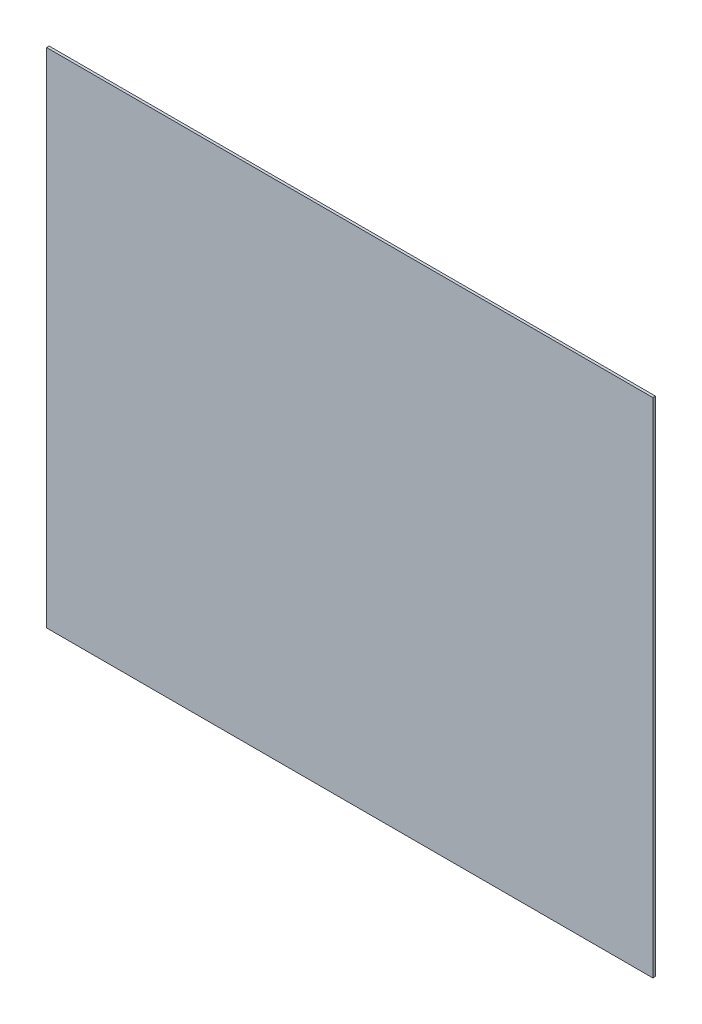
ISO-10303-21;
HEADER;
FILE_DESCRIPTION(('STEP AP214'),'2;1');
FILE_NAME('part.step','',(''),(''),'','','');
FILE_SCHEMA(('AUTOMOTIVE_DESIGN { 1 0 10303 214 1 1 1 1 }'));
ENDSEC;
DATA;
#1=APPLICATION_CONTEXT('core data for automotive mechanical design processes');
#2=APPLICATION_PROTOCOL_DEFINITION('international standard','automotive_design',2000,#1);
#3=PRODUCT_CONTEXT('',#1,'mechanical');
#4=PRODUCT('Part','Part','',(#3));
#5=PRODUCT_RELATED_PRODUCT_CATEGORY('part','',(#4));
#6=PRODUCT_DEFINITION_FORMATION('','',#4);
#7=PRODUCT_DEFINITION_CONTEXT('part definition',#1,'design');
#8=PRODUCT_DEFINITION('design','',#6,#7);
#9=PRODUCT_DEFINITION_SHAPE('','',#8);
#10=(LENGTH_UNIT() NAMED_UNIT(*) SI_UNIT(.MILLI.,.METRE.));
#11=(NAMED_UNIT(*) PLANE_ANGLE_UNIT() SI_UNIT($,.RADIAN.));
#12=(NAMED_UNIT(*) SI_UNIT($,.STERADIAN.) SOLID_ANGLE_UNIT());
#13=UNCERTAINTY_MEASURE_WITH_UNIT(LENGTH_MEASURE(1.E-05),#10,'distance_accuracy_value','');
#14=(GEOMETRIC_REPRESENTATION_CONTEXT(3) GLOBAL_UNCERTAINTY_ASSIGNED_CONTEXT((#13)) GLOBAL_UNIT_ASSIGNED_CONTEXT((#10,
#11,#12)) REPRESENTATION_CONTEXT('',''));
#15=CARTESIAN_POINT('',(0.,0.,0.));
#16=DIRECTION('',(0.,0.,1.));
#17=DIRECTION('',(1.,0.,0.));
#18=AXIS2_PLACEMENT_3D('',#15,#16,#17);
#19=CARTESIAN_POINT('',(371.475,-307.975,3.175));
#20=DIRECTION('',(-1.,0.,0.));
#21=DIRECTION('',(0.,0.,1.));
#22=AXIS2_PLACEMENT_3D('',#19,#20,#21);
#23=PLANE('',#22);
#24=DIRECTION('',(0.,1.,0.));
#25=VECTOR('',#24,1.);
#26=CARTESIAN_POINT('',(371.475,-307.975,0.));
#27=LINE('',#26,#25);
#28=CARTESIAN_POINT('',(371.475,-307.975,0.));
#29=VERTEX_POINT('',#28);
#30=CARTESIAN_POINT('',(371.475,307.975,0.));
#31=VERTEX_POINT('',#30);
#32=EDGE_CURVE('E102',#29,#31,#27,.T.);
#33=ORIENTED_EDGE('',*,*,#32,.T.);
#34=DIRECTION('',(0.,0.,-1.));
#35=VECTOR('',#34,1.);
#36=CARTESIAN_POINT('',(371.475,307.975,3.175));
#37=LINE('',#36,#35);
#38=CARTESIAN_POINT('',(371.475,307.975,3.175));
#39=VERTEX_POINT('',#38);
#40=EDGE_CURVE('E11',#39,#31,#37,.T.);
#41=ORIENTED_EDGE('',*,*,#40,.F.);
#42=DIRECTION('',(0.,1.,0.));
#43=VECTOR('',#42,1.);
#44=CARTESIAN_POINT('',(371.475,-307.975,3.175));
#45=LINE('',#44,#43);
#46=CARTESIAN_POINT('',(371.475,-307.975,3.175));
#47=VERTEX_POINT('',#46);
#48=EDGE_CURVE('E90',#47,#39,#45,.T.);
#49=ORIENTED_EDGE('',*,*,#48,.F.);
#50=DIRECTION('',(0.,0.,-1.));
#51=VECTOR('',#50,1.);
#52=CARTESIAN_POINT('',(371.475,-307.975,3.175));
#53=LINE('',#52,#51);
#54=EDGE_CURVE('E98',#47,#29,#53,.T.);
#55=ORIENTED_EDGE('',*,*,#54,.T.);
#56=EDGE_LOOP('',(#33,#41,#49,#55));
#57=FACE_BOUND('',#56,.T.);
#58=ADVANCED_FACE('F39',(#57),#23,.F.);
#59=CARTESIAN_POINT('',(-371.475,307.975,3.175));
#60=DIRECTION('',(0.,-1.,0.));
#61=DIRECTION('',(0.,0.,-1.));
#62=AXIS2_PLACEMENT_3D('',#59,#60,#61);
#63=PLANE('',#62);
#64=DIRECTION('',(-1.,0.,0.));
#65=VECTOR('',#64,1.);
#66=CARTESIAN_POINT('',(-371.475,307.975,0.));
#67=LINE('',#66,#65);
#68=CARTESIAN_POINT('',(-371.475,307.975,0.));
#69=VERTEX_POINT('',#68);
#70=EDGE_CURVE('E94',#31,#69,#67,.T.);
#71=ORIENTED_EDGE('',*,*,#70,.T.);
#72=DIRECTION('',(0.,0.,-1.));
#73=VECTOR('',#72,1.);
#74=CARTESIAN_POINT('',(-371.475,307.975,3.175));
#75=LINE('',#74,#73);
#76=CARTESIAN_POINT('',(-371.475,307.975,3.175));
#77=VERTEX_POINT('',#76);
#78=EDGE_CURVE('E47',#77,#69,#75,.T.);
#79=ORIENTED_EDGE('',*,*,#78,.F.);
#80=DIRECTION('',(-1.,0.,0.));
#81=VECTOR('',#80,1.);
#82=CARTESIAN_POINT('',(-371.475,307.975,3.175));
#83=LINE('',#82,#81);
#84=EDGE_CURVE('E85',#39,#77,#83,.T.);
#85=ORIENTED_EDGE('',*,*,#84,.F.);
#86=ORIENTED_EDGE('',*,*,#40,.T.);
#87=EDGE_LOOP('',(#71,#79,#85,#86));
#88=FACE_BOUND('',#87,.T.);
#89=ADVANCED_FACE('F93',(#88),#63,.F.);
#90=CARTESIAN_POINT('',(-371.475,-307.975,3.175));
#91=DIRECTION('',(1.,0.,0.));
#92=DIRECTION('',(0.,0.,-1.));
#93=AXIS2_PLACEMENT_3D('',#90,#91,#92);
#94=PLANE('',#93);
#95=DIRECTION('',(0.,-1.,0.));
#96=VECTOR('',#95,1.);
#97=CARTESIAN_POINT('',(-371.475,-307.975,0.));
#98=LINE('',#97,#96);
#99=CARTESIAN_POINT('',(-371.475,-307.975,0.));
#100=VERTEX_POINT('',#99);
#101=EDGE_CURVE('E72',#69,#100,#98,.T.);
#102=ORIENTED_EDGE('',*,*,#101,.T.);
#103=DIRECTION('',(0.,0.,-1.));
#104=VECTOR('',#103,1.);
#105=CARTESIAN_POINT('',(-371.475,-307.975,3.175));
#106=LINE('',#105,#104);
#107=CARTESIAN_POINT('',(-371.475,-307.975,3.175));
#108=VERTEX_POINT('',#107);
#109=EDGE_CURVE('E95',#108,#100,#106,.T.);
#110=ORIENTED_EDGE('',*,*,#109,.F.);
#111=DIRECTION('',(0.,-1.,0.));
#112=VECTOR('',#111,1.);
#113=CARTESIAN_POINT('',(-371.475,-307.975,3.175));
#114=LINE('',#113,#112);
#115=EDGE_CURVE('E88',#77,#108,#114,.T.);
#116=ORIENTED_EDGE('',*,*,#115,.F.);
#117=ORIENTED_EDGE('',*,*,#78,.T.);
#118=EDGE_LOOP('',(#102,#110,#116,#117));
#119=FACE_BOUND('',#118,.T.);
#120=ADVANCED_FACE('F96',(#119),#94,.F.);
#121=CARTESIAN_POINT('',(-371.475,-307.975,3.175));
#122=DIRECTION('',(0.,1.,0.));
#123=DIRECTION('',(0.,0.,1.));
#124=AXIS2_PLACEMENT_3D('',#121,#122,#123);
#125=PLANE('',#124);
#126=DIRECTION('',(1.,0.,0.));
#127=VECTOR('',#126,1.);
#128=CARTESIAN_POINT('',(-371.475,-307.975,0.));
#129=LINE('',#128,#127);
#130=EDGE_CURVE('E78',#100,#29,#129,.T.);
#131=ORIENTED_EDGE('',*,*,#130,.T.);
#132=ORIENTED_EDGE('',*,*,#54,.F.);
#133=DIRECTION('',(1.,0.,0.));
#134=VECTOR('',#133,1.);
#135=CARTESIAN_POINT('',(-371.475,-307.975,3.175));
#136=LINE('',#135,#134);
#137=EDGE_CURVE('E55',#108,#47,#136,.T.);
#138=ORIENTED_EDGE('',*,*,#137,.F.);
#139=ORIENTED_EDGE('',*,*,#109,.T.);
#140=EDGE_LOOP('',(#131,#132,#138,#139));
#141=FACE_BOUND('',#140,.T.);
#142=ADVANCED_FACE('F109',(#141),#125,.F.);
#143=CARTESIAN_POINT('',(0.,0.,3.175));
#144=DIRECTION('',(0.,0.,-1.));
#145=DIRECTION('',(-1.,0.,0.));
#146=AXIS2_PLACEMENT_3D('',#143,#144,#145);
#147=PLANE('',#146);
#148=ORIENTED_EDGE('',*,*,#48,.T.);
#149=ORIENTED_EDGE('',*,*,#84,.T.);
#150=ORIENTED_EDGE('',*,*,#115,.T.);
#151=ORIENTED_EDGE('',*,*,#137,.T.);
#152=EDGE_LOOP('',(#148,#149,#150,#151));
#153=FACE_BOUND('',#152,.T.);
#154=ADVANCED_FACE('F86',(#153),#147,.F.);
#155=CARTESIAN_POINT('',(0.,0.,0.));
#156=DIRECTION('',(0.,0.,-1.));
#157=DIRECTION('',(-1.,0.,0.));
#158=AXIS2_PLACEMENT_3D('',#155,#156,#157);
#159=PLANE('',#158);
#160=ORIENTED_EDGE('',*,*,#32,.F.);
#161=ORIENTED_EDGE('',*,*,#130,.F.);
#162=ORIENTED_EDGE('',*,*,#101,.F.);
#163=ORIENTED_EDGE('',*,*,#70,.F.);
#164=EDGE_LOOP('',(#160,#161,#162,#163));
#165=FACE_BOUND('',#164,.T.);
#166=ADVANCED_FACE('F112',(#165),#159,.T.);
#167=CLOSED_SHELL('',(#58,#89,#120,#142,#154,#166));
#168=MANIFOLD_SOLID_BREP('B2',#167);
#169=ADVANCED_BREP_SHAPE_REPRESENTATION('',(#18,#168),#14);
#170=SHAPE_DEFINITION_REPRESENTATION(#9,#169);
ENDSEC;
END-ISO-10303-21;
